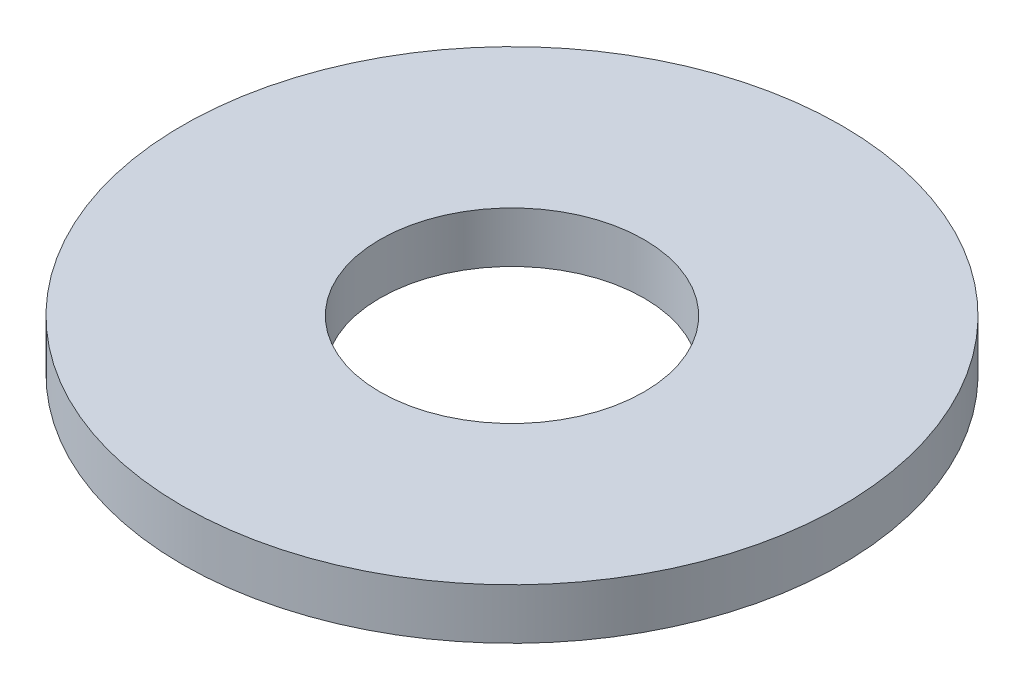
ISO-10303-21;
HEADER;
FILE_DESCRIPTION(('STEP AP214'),'2;1');
FILE_NAME('part.step','',(''),(''),'','','');
FILE_SCHEMA(('AUTOMOTIVE_DESIGN { 1 0 10303 214 1 1 1 1 }'));
ENDSEC;
DATA;
#1=APPLICATION_CONTEXT('core data for automotive mechanical design processes');
#2=APPLICATION_PROTOCOL_DEFINITION('international standard','automotive_design',2000,#1);
#3=PRODUCT_CONTEXT('',#1,'mechanical');
#4=PRODUCT('Part','Part','',(#3));
#5=PRODUCT_RELATED_PRODUCT_CATEGORY('part','',(#4));
#6=PRODUCT_DEFINITION_FORMATION('','',#4);
#7=PRODUCT_DEFINITION_CONTEXT('part definition',#1,'design');
#8=PRODUCT_DEFINITION('design','',#6,#7);
#9=PRODUCT_DEFINITION_SHAPE('','',#8);
#10=(LENGTH_UNIT() NAMED_UNIT(*) SI_UNIT(.MILLI.,.METRE.));
#11=(NAMED_UNIT(*) PLANE_ANGLE_UNIT() SI_UNIT($,.RADIAN.));
#12=(NAMED_UNIT(*) SI_UNIT($,.STERADIAN.) SOLID_ANGLE_UNIT());
#13=UNCERTAINTY_MEASURE_WITH_UNIT(LENGTH_MEASURE(1.E-05),#10,'distance_accuracy_value','');
#14=(GEOMETRIC_REPRESENTATION_CONTEXT(3) GLOBAL_UNCERTAINTY_ASSIGNED_CONTEXT((#13)) GLOBAL_UNIT_ASSIGNED_CONTEXT((#10,
#11,#12)) REPRESENTATION_CONTEXT('',''));
#15=CARTESIAN_POINT('',(0.,0.,0.));
#16=DIRECTION('',(0.,0.,1.));
#17=DIRECTION('',(1.,0.,0.));
#18=AXIS2_PLACEMENT_3D('',#15,#16,#17);
#19=CARTESIAN_POINT('',(0.,0.6096,0.));
#20=DIRECTION('',(0.,-1.,0.));
#21=DIRECTION('',(0.,0.,-1.));
#22=AXIS2_PLACEMENT_3D('',#19,#20,#21);
#23=CYLINDRICAL_SURFACE('',#22,3.9624);
#24=CARTESIAN_POINT('',(0.,0.6096,0.));
#25=DIRECTION('',(0.,1.,0.));
#26=DIRECTION('',(0.,0.,1.));
#27=AXIS2_PLACEMENT_3D('',#24,#25,#26);
#28=CIRCLE('',#27,3.9624);
#29=CARTESIAN_POINT('',(0.,0.6096,3.9624));
#30=VERTEX_POINT('',#29);
#31=EDGE_CURVE('E10',#30,#30,#28,.T.);
#32=ORIENTED_EDGE('',*,*,#31,.F.);
#33=EDGE_LOOP('',(#32));
#34=FACE_BOUND('',#33,.T.);
#35=CARTESIAN_POINT('',(0.,0.,0.));
#36=DIRECTION('',(0.,1.,0.));
#37=DIRECTION('',(0.,0.,1.));
#38=AXIS2_PLACEMENT_3D('',#35,#36,#37);
#39=CIRCLE('',#38,3.9624);
#40=CARTESIAN_POINT('',(0.,0.,3.9624));
#41=VERTEX_POINT('',#40);
#42=EDGE_CURVE('E33',#41,#41,#39,.T.);
#43=ORIENTED_EDGE('',*,*,#42,.T.);
#44=EDGE_LOOP('',(#43));
#45=FACE_BOUND('',#44,.T.);
#46=ADVANCED_FACE('F30',(#34,#45),#23,.T.);
#47=CARTESIAN_POINT('',(0.,0.6096,0.));
#48=DIRECTION('',(0.,1.,0.));
#49=DIRECTION('',(0.,0.,1.));
#50=AXIS2_PLACEMENT_3D('',#47,#48,#49);
#51=PLANE('',#50);
#52=CARTESIAN_POINT('',(0.,0.6096,0.));
#53=DIRECTION('',(0.,1.,0.));
#54=DIRECTION('',(0.,0.,1.));
#55=AXIS2_PLACEMENT_3D('',#52,#53,#54);
#56=CIRCLE('',#55,1.5875);
#57=CARTESIAN_POINT('',(0.,0.6096,1.5875));
#58=VERTEX_POINT('',#57);
#59=EDGE_CURVE('E42',#58,#58,#56,.T.);
#60=ORIENTED_EDGE('',*,*,#59,.F.);
#61=EDGE_LOOP('',(#60));
#62=FACE_BOUND('',#61,.T.);
#63=ORIENTED_EDGE('',*,*,#31,.T.);
#64=EDGE_LOOP('',(#63));
#65=FACE_BOUND('',#64,.T.);
#66=ADVANCED_FACE('F57',(#62,#65),#51,.T.);
#67=CARTESIAN_POINT('',(0.,0.,0.));
#68=DIRECTION('',(0.,1.,0.));
#69=DIRECTION('',(0.,0.,1.));
#70=AXIS2_PLACEMENT_3D('',#67,#68,#69);
#71=PLANE('',#70);
#72=CARTESIAN_POINT('',(0.,0.,0.));
#73=DIRECTION('',(0.,1.,0.));
#74=DIRECTION('',(0.,0.,1.));
#75=AXIS2_PLACEMENT_3D('',#72,#73,#74);
#76=CIRCLE('',#75,1.5875);
#77=CARTESIAN_POINT('',(0.,0.,1.5875));
#78=VERTEX_POINT('',#77);
#79=EDGE_CURVE('E40',#78,#78,#76,.T.);
#80=ORIENTED_EDGE('',*,*,#79,.T.);
#81=EDGE_LOOP('',(#80));
#82=FACE_BOUND('',#81,.T.);
#83=ORIENTED_EDGE('',*,*,#42,.F.);
#84=EDGE_LOOP('',(#83));
#85=FACE_BOUND('',#84,.T.);
#86=ADVANCED_FACE('F48',(#82,#85),#71,.F.);
#87=CARTESIAN_POINT('',(0.,0.,0.));
#88=DIRECTION('',(0.,1.,0.));
#89=DIRECTION('',(0.,0.,1.));
#90=AXIS2_PLACEMENT_3D('',#87,#88,#89);
#91=CYLINDRICAL_SURFACE('',#90,1.5875);
#92=ORIENTED_EDGE('',*,*,#79,.F.);
#93=EDGE_LOOP('',(#92));
#94=FACE_BOUND('',#93,.T.);
#95=ORIENTED_EDGE('',*,*,#59,.T.);
#96=EDGE_LOOP('',(#95));
#97=FACE_BOUND('',#96,.T.);
#98=ADVANCED_FACE('F51',(#94,#97),#91,.F.);
#99=CLOSED_SHELL('',(#46,#66,#86,#98));
#100=MANIFOLD_SOLID_BREP('B2',#99);
#101=ADVANCED_BREP_SHAPE_REPRESENTATION('',(#18,#100),#14);
#102=SHAPE_DEFINITION_REPRESENTATION(#9,#101);
ENDSEC;
END-ISO-10303-21;
